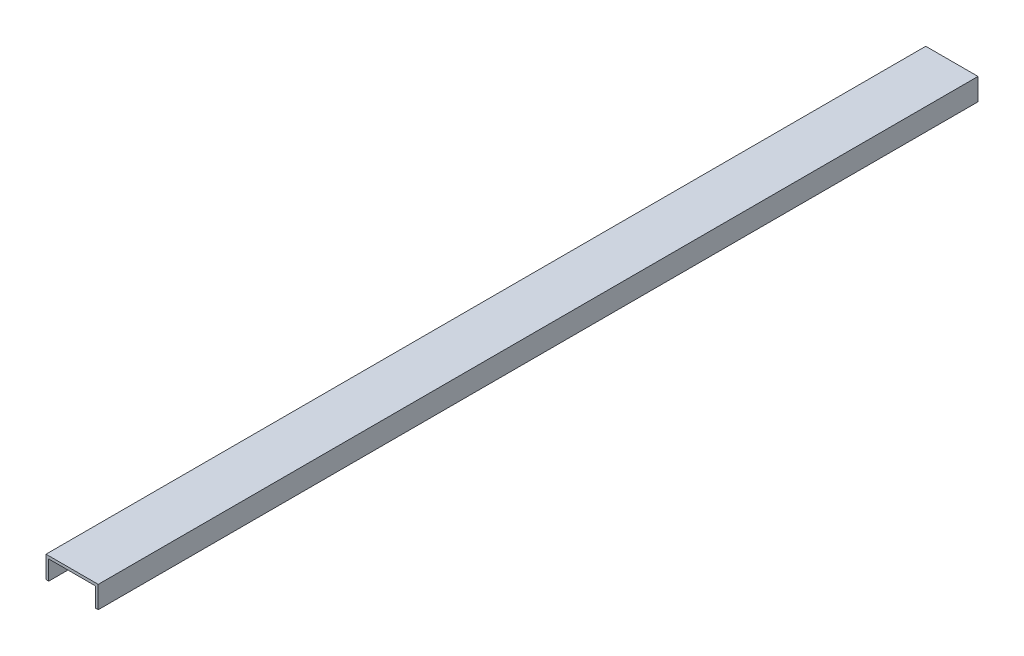
ISO-10303-21;
HEADER;
FILE_DESCRIPTION(('STEP AP214'),'2;1');
FILE_NAME('part.step','',(''),(''),'','','');
FILE_SCHEMA(('AUTOMOTIVE_DESIGN { 1 0 10303 214 1 1 1 1 }'));
ENDSEC;
DATA;
#1=APPLICATION_CONTEXT('core data for automotive mechanical design processes');
#2=APPLICATION_PROTOCOL_DEFINITION('international standard','automotive_design',2000,#1);
#3=PRODUCT_CONTEXT('',#1,'mechanical');
#4=PRODUCT('Part','Part','',(#3));
#5=PRODUCT_RELATED_PRODUCT_CATEGORY('part','',(#4));
#6=PRODUCT_DEFINITION_FORMATION('','',#4);
#7=PRODUCT_DEFINITION_CONTEXT('part definition',#1,'design');
#8=PRODUCT_DEFINITION('design','',#6,#7);
#9=PRODUCT_DEFINITION_SHAPE('','',#8);
#10=(LENGTH_UNIT() NAMED_UNIT(*) SI_UNIT(.MILLI.,.METRE.));
#11=(NAMED_UNIT(*) PLANE_ANGLE_UNIT() SI_UNIT($,.RADIAN.));
#12=(NAMED_UNIT(*) SI_UNIT($,.STERADIAN.) SOLID_ANGLE_UNIT());
#13=UNCERTAINTY_MEASURE_WITH_UNIT(LENGTH_MEASURE(1.E-05),#10,'distance_accuracy_value','');
#14=(GEOMETRIC_REPRESENTATION_CONTEXT(3) GLOBAL_UNCERTAINTY_ASSIGNED_CONTEXT((#13)) GLOBAL_UNIT_ASSIGNED_CONTEXT((#10,
#11,#12)) REPRESENTATION_CONTEXT('',''));
#15=CARTESIAN_POINT('',(0.,0.,0.));
#16=DIRECTION('',(0.,0.,1.));
#17=DIRECTION('',(1.,0.,0.));
#18=AXIS2_PLACEMENT_3D('',#15,#16,#17);
#19=CARTESIAN_POINT('',(8.5,0.,320.));
#20=DIRECTION('',(1.,0.,0.));
#21=DIRECTION('',(0.,0.,-1.));
#22=AXIS2_PLACEMENT_3D('',#19,#20,#21);
#23=PLANE('',#22);
#24=DIRECTION('',(0.,-1.,0.));
#25=VECTOR('',#24,1.);
#26=CARTESIAN_POINT('',(8.5,0.,0.));
#27=LINE('',#26,#25);
#28=CARTESIAN_POINT('',(8.5,0.,0.));
#29=VERTEX_POINT('',#28);
#30=CARTESIAN_POINT('',(8.5,-7.,0.));
#31=VERTEX_POINT('',#30);
#32=EDGE_CURVE('E132',#29,#31,#27,.T.);
#33=ORIENTED_EDGE('',*,*,#32,.T.);
#34=DIRECTION('',(0.,0.,-1.));
#35=VECTOR('',#34,1.);
#36=CARTESIAN_POINT('',(8.5,-7.,320.));
#37=LINE('',#36,#35);
#38=CARTESIAN_POINT('',(8.5,-7.,320.));
#39=VERTEX_POINT('',#38);
#40=EDGE_CURVE('E40',#39,#31,#37,.T.);
#41=ORIENTED_EDGE('',*,*,#40,.F.);
#42=DIRECTION('',(0.,-1.,0.));
#43=VECTOR('',#42,1.);
#44=CARTESIAN_POINT('',(8.5,0.,320.));
#45=LINE('',#44,#43);
#46=CARTESIAN_POINT('',(8.5,0.,320.));
#47=VERTEX_POINT('',#46);
#48=EDGE_CURVE('E92',#47,#39,#45,.T.);
#49=ORIENTED_EDGE('',*,*,#48,.F.);
#50=DIRECTION('',(0.,0.,-1.));
#51=VECTOR('',#50,1.);
#52=CARTESIAN_POINT('',(8.5,0.,320.));
#53=LINE('',#52,#51);
#54=EDGE_CURVE('E11',#47,#29,#53,.T.);
#55=ORIENTED_EDGE('',*,*,#54,.T.);
#56=EDGE_LOOP('',(#33,#41,#49,#55));
#57=FACE_BOUND('',#56,.T.);
#58=ADVANCED_FACE('F32',(#57),#23,.F.);
#59=CARTESIAN_POINT('',(8.5,-7.,320.));
#60=DIRECTION('',(0.,1.,0.));
#61=DIRECTION('',(0.,0.,1.));
#62=AXIS2_PLACEMENT_3D('',#59,#60,#61);
#63=PLANE('',#62);
#64=DIRECTION('',(1.,0.,0.));
#65=VECTOR('',#64,1.);
#66=CARTESIAN_POINT('',(8.5,-7.,0.));
#67=LINE('',#66,#65);
#68=CARTESIAN_POINT('',(9.5,-7.,0.));
#69=VERTEX_POINT('',#68);
#70=EDGE_CURVE('E134',#31,#69,#67,.T.);
#71=ORIENTED_EDGE('',*,*,#70,.T.);
#72=DIRECTION('',(0.,0.,-1.));
#73=VECTOR('',#72,1.);
#74=CARTESIAN_POINT('',(9.5,-7.,320.));
#75=LINE('',#74,#73);
#76=CARTESIAN_POINT('',(9.5,-7.,320.));
#77=VERTEX_POINT('',#76);
#78=EDGE_CURVE('E151',#77,#69,#75,.T.);
#79=ORIENTED_EDGE('',*,*,#78,.F.);
#80=DIRECTION('',(1.,0.,0.));
#81=VECTOR('',#80,1.);
#82=CARTESIAN_POINT('',(8.5,-7.,320.));
#83=LINE('',#82,#81);
#84=EDGE_CURVE('E159',#39,#77,#83,.T.);
#85=ORIENTED_EDGE('',*,*,#84,.F.);
#86=ORIENTED_EDGE('',*,*,#40,.T.);
#87=EDGE_LOOP('',(#71,#79,#85,#86));
#88=FACE_BOUND('',#87,.T.);
#89=ADVANCED_FACE('F157',(#88),#63,.F.);
#90=CARTESIAN_POINT('',(9.5,-7.,320.));
#91=DIRECTION('',(-1.,0.,0.));
#92=DIRECTION('',(0.,0.,1.));
#93=AXIS2_PLACEMENT_3D('',#90,#91,#92);
#94=PLANE('',#93);
#95=DIRECTION('',(0.,1.,0.));
#96=VECTOR('',#95,1.);
#97=CARTESIAN_POINT('',(9.5,-7.,0.));
#98=LINE('',#97,#96);
#99=CARTESIAN_POINT('',(9.5,0.999999999999999,0.));
#100=VERTEX_POINT('',#99);
#101=EDGE_CURVE('E136',#69,#100,#98,.T.);
#102=ORIENTED_EDGE('',*,*,#101,.T.);
#103=DIRECTION('',(0.,0.,-1.));
#104=VECTOR('',#103,1.);
#105=CARTESIAN_POINT('',(9.5,0.999999999999999,320.));
#106=LINE('',#105,#104);
#107=CARTESIAN_POINT('',(9.5,0.999999999999999,320.));
#108=VERTEX_POINT('',#107);
#109=EDGE_CURVE('E148',#108,#100,#106,.T.);
#110=ORIENTED_EDGE('',*,*,#109,.F.);
#111=DIRECTION('',(0.,1.,0.));
#112=VECTOR('',#111,1.);
#113=CARTESIAN_POINT('',(9.5,-7.,320.));
#114=LINE('',#113,#112);
#115=EDGE_CURVE('E172',#77,#108,#114,.T.);
#116=ORIENTED_EDGE('',*,*,#115,.F.);
#117=ORIENTED_EDGE('',*,*,#78,.T.);
#118=EDGE_LOOP('',(#102,#110,#116,#117));
#119=FACE_BOUND('',#118,.T.);
#120=ADVANCED_FACE('F168',(#119),#94,.F.);
#121=CARTESIAN_POINT('',(9.5,0.999999999999999,320.));
#122=DIRECTION('',(0.,-1.,0.));
#123=DIRECTION('',(1.,0.,0.));
#124=AXIS2_PLACEMENT_3D('',#121,#122,#123);
#125=PLANE('',#124);
#126=DIRECTION('',(-1.,0.,0.));
#127=VECTOR('',#126,1.);
#128=CARTESIAN_POINT('',(9.5,0.999999999999999,0.));
#129=LINE('',#128,#127);
#130=CARTESIAN_POINT('',(-9.5,0.999999999999997,0.));
#131=VERTEX_POINT('',#130);
#132=EDGE_CURVE('E138',#100,#131,#129,.T.);
#133=ORIENTED_EDGE('',*,*,#132,.T.);
#134=DIRECTION('',(0.,0.,-1.));
#135=VECTOR('',#134,1.);
#136=CARTESIAN_POINT('',(-9.5,0.999999999999997,320.));
#137=LINE('',#136,#135);
#138=CARTESIAN_POINT('',(-9.5,0.999999999999997,320.));
#139=VERTEX_POINT('',#138);
#140=EDGE_CURVE('E121',#139,#131,#137,.T.);
#141=ORIENTED_EDGE('',*,*,#140,.F.);
#142=DIRECTION('',(-1.,0.,0.));
#143=VECTOR('',#142,1.);
#144=CARTESIAN_POINT('',(9.5,0.999999999999999,320.));
#145=LINE('',#144,#143);
#146=EDGE_CURVE('E112',#108,#139,#145,.T.);
#147=ORIENTED_EDGE('',*,*,#146,.F.);
#148=ORIENTED_EDGE('',*,*,#109,.T.);
#149=EDGE_LOOP('',(#133,#141,#147,#148));
#150=FACE_BOUND('',#149,.T.);
#151=ADVANCED_FACE('F171',(#150),#125,.F.);
#152=CARTESIAN_POINT('',(-9.5,0.999999999999997,320.));
#153=DIRECTION('',(1.,0.,0.));
#154=DIRECTION('',(0.,0.,-1.));
#155=AXIS2_PLACEMENT_3D('',#152,#153,#154);
#156=PLANE('',#155);
#157=DIRECTION('',(0.,-1.,0.));
#158=VECTOR('',#157,1.);
#159=CARTESIAN_POINT('',(-9.5,0.999999999999997,0.));
#160=LINE('',#159,#158);
#161=CARTESIAN_POINT('',(-9.5,-7.,0.));
#162=VERTEX_POINT('',#161);
#163=EDGE_CURVE('E120',#131,#162,#160,.T.);
#164=ORIENTED_EDGE('',*,*,#163,.T.);
#165=DIRECTION('',(0.,0.,-1.));
#166=VECTOR('',#165,1.);
#167=CARTESIAN_POINT('',(-9.5,-7.,320.));
#168=LINE('',#167,#166);
#169=CARTESIAN_POINT('',(-9.5,-7.,320.));
#170=VERTEX_POINT('',#169);
#171=EDGE_CURVE('E117',#170,#162,#168,.T.);
#172=ORIENTED_EDGE('',*,*,#171,.F.);
#173=DIRECTION('',(0.,-1.,0.));
#174=VECTOR('',#173,1.);
#175=CARTESIAN_POINT('',(-9.5,0.999999999999997,320.));
#176=LINE('',#175,#174);
#177=EDGE_CURVE('E106',#139,#170,#176,.T.);
#178=ORIENTED_EDGE('',*,*,#177,.F.);
#179=ORIENTED_EDGE('',*,*,#140,.T.);
#180=EDGE_LOOP('',(#164,#172,#178,#179));
#181=FACE_BOUND('',#180,.T.);
#182=ADVANCED_FACE('F118',(#181),#156,.F.);
#183=CARTESIAN_POINT('',(-9.5,-7.,320.));
#184=DIRECTION('',(0.,1.,0.));
#185=DIRECTION('',(0.,0.,1.));
#186=AXIS2_PLACEMENT_3D('',#183,#184,#185);
#187=PLANE('',#186);
#188=DIRECTION('',(1.,0.,0.));
#189=VECTOR('',#188,1.);
#190=CARTESIAN_POINT('',(-9.5,-7.,0.));
#191=LINE('',#190,#189);
#192=CARTESIAN_POINT('',(-8.5,-7.,0.));
#193=VERTEX_POINT('',#192);
#194=EDGE_CURVE('E78',#162,#193,#191,.T.);
#195=ORIENTED_EDGE('',*,*,#194,.T.);
#196=DIRECTION('',(0.,0.,-1.));
#197=VECTOR('',#196,1.);
#198=CARTESIAN_POINT('',(-8.5,-7.,320.));
#199=LINE('',#198,#197);
#200=CARTESIAN_POINT('',(-8.5,-7.,320.));
#201=VERTEX_POINT('',#200);
#202=EDGE_CURVE('E122',#201,#193,#199,.T.);
#203=ORIENTED_EDGE('',*,*,#202,.F.);
#204=DIRECTION('',(1.,0.,0.));
#205=VECTOR('',#204,1.);
#206=CARTESIAN_POINT('',(-9.5,-7.,320.));
#207=LINE('',#206,#205);
#208=EDGE_CURVE('E110',#170,#201,#207,.T.);
#209=ORIENTED_EDGE('',*,*,#208,.F.);
#210=ORIENTED_EDGE('',*,*,#171,.T.);
#211=EDGE_LOOP('',(#195,#203,#209,#210));
#212=FACE_BOUND('',#211,.T.);
#213=ADVANCED_FACE('F124',(#212),#187,.F.);
#214=CARTESIAN_POINT('',(-8.5,0.,320.));
#215=DIRECTION('',(-1.,0.,0.));
#216=DIRECTION('',(0.,0.,1.));
#217=AXIS2_PLACEMENT_3D('',#214,#215,#216);
#218=PLANE('',#217);
#219=DIRECTION('',(0.,1.,0.));
#220=VECTOR('',#219,1.);
#221=CARTESIAN_POINT('',(-8.5,0.,0.));
#222=LINE('',#221,#220);
#223=CARTESIAN_POINT('',(-8.5,0.,0.));
#224=VERTEX_POINT('',#223);
#225=EDGE_CURVE('E85',#193,#224,#222,.T.);
#226=ORIENTED_EDGE('',*,*,#225,.T.);
#227=DIRECTION('',(0.,0.,-1.));
#228=VECTOR('',#227,1.);
#229=CARTESIAN_POINT('',(-8.5,0.,320.));
#230=LINE('',#229,#228);
#231=CARTESIAN_POINT('',(-8.5,0.,320.));
#232=VERTEX_POINT('',#231);
#233=EDGE_CURVE('E128',#232,#224,#230,.T.);
#234=ORIENTED_EDGE('',*,*,#233,.F.);
#235=DIRECTION('',(0.,1.,0.));
#236=VECTOR('',#235,1.);
#237=CARTESIAN_POINT('',(-8.5,0.,320.));
#238=LINE('',#237,#236);
#239=EDGE_CURVE('E126',#201,#232,#238,.T.);
#240=ORIENTED_EDGE('',*,*,#239,.F.);
#241=ORIENTED_EDGE('',*,*,#202,.T.);
#242=EDGE_LOOP('',(#226,#234,#240,#241));
#243=FACE_BOUND('',#242,.T.);
#244=ADVANCED_FACE('F193',(#243),#218,.F.);
#245=CARTESIAN_POINT('',(0.,0.,320.));
#246=DIRECTION('',(0.,1.,0.));
#247=DIRECTION('',(-1.,0.,0.));
#248=AXIS2_PLACEMENT_3D('',#245,#246,#247);
#249=PLANE('',#248);
#250=DIRECTION('',(1.,0.,0.));
#251=VECTOR('',#250,1.);
#252=CARTESIAN_POINT('',(0.,0.,0.));
#253=LINE('',#252,#251);
#254=EDGE_CURVE('E143',#224,#29,#253,.T.);
#255=ORIENTED_EDGE('',*,*,#254,.T.);
#256=ORIENTED_EDGE('',*,*,#54,.F.);
#257=DIRECTION('',(1.,0.,0.));
#258=VECTOR('',#257,1.);
#259=CARTESIAN_POINT('',(0.,0.,320.));
#260=LINE('',#259,#258);
#261=EDGE_CURVE('E48',#232,#47,#260,.T.);
#262=ORIENTED_EDGE('',*,*,#261,.F.);
#263=ORIENTED_EDGE('',*,*,#233,.T.);
#264=EDGE_LOOP('',(#255,#256,#262,#263));
#265=FACE_BOUND('',#264,.T.);
#266=ADVANCED_FACE('F177',(#265),#249,.F.);
#267=CARTESIAN_POINT('',(0.,0.,320.));
#268=DIRECTION('',(0.,0.,-1.));
#269=DIRECTION('',(-1.,0.,0.));
#270=AXIS2_PLACEMENT_3D('',#267,#268,#269);
#271=PLANE('',#270);
#272=ORIENTED_EDGE('',*,*,#261,.T.);
#273=ORIENTED_EDGE('',*,*,#48,.T.);
#274=ORIENTED_EDGE('',*,*,#84,.T.);
#275=ORIENTED_EDGE('',*,*,#115,.T.);
#276=ORIENTED_EDGE('',*,*,#146,.T.);
#277=ORIENTED_EDGE('',*,*,#177,.T.);
#278=ORIENTED_EDGE('',*,*,#208,.T.);
#279=ORIENTED_EDGE('',*,*,#239,.T.);
#280=EDGE_LOOP('',(#272,#273,#274,#275,#276,#277,#278,#279));
#281=FACE_BOUND('',#280,.T.);
#282=ADVANCED_FACE('F108',(#281),#271,.F.);
#283=CARTESIAN_POINT('',(0.,0.,0.));
#284=DIRECTION('',(0.,0.,-1.));
#285=DIRECTION('',(-1.,0.,0.));
#286=AXIS2_PLACEMENT_3D('',#283,#284,#285);
#287=PLANE('',#286);
#288=ORIENTED_EDGE('',*,*,#32,.F.);
#289=ORIENTED_EDGE('',*,*,#254,.F.);
#290=ORIENTED_EDGE('',*,*,#225,.F.);
#291=ORIENTED_EDGE('',*,*,#194,.F.);
#292=ORIENTED_EDGE('',*,*,#163,.F.);
#293=ORIENTED_EDGE('',*,*,#132,.F.);
#294=ORIENTED_EDGE('',*,*,#101,.F.);
#295=ORIENTED_EDGE('',*,*,#70,.F.);
#296=EDGE_LOOP('',(#288,#289,#290,#291,#292,#293,#294,#295));
#297=FACE_BOUND('',#296,.T.);
#298=ADVANCED_FACE('F163',(#297),#287,.T.);
#299=CLOSED_SHELL('',(#58,#89,#120,#151,#182,#213,#244,#266,#282,#298));
#300=MANIFOLD_SOLID_BREP('B2',#299);
#301=ADVANCED_BREP_SHAPE_REPRESENTATION('',(#18,#300),#14);
#302=SHAPE_DEFINITION_REPRESENTATION(#9,#301);
ENDSEC;
END-ISO-10303-21;
